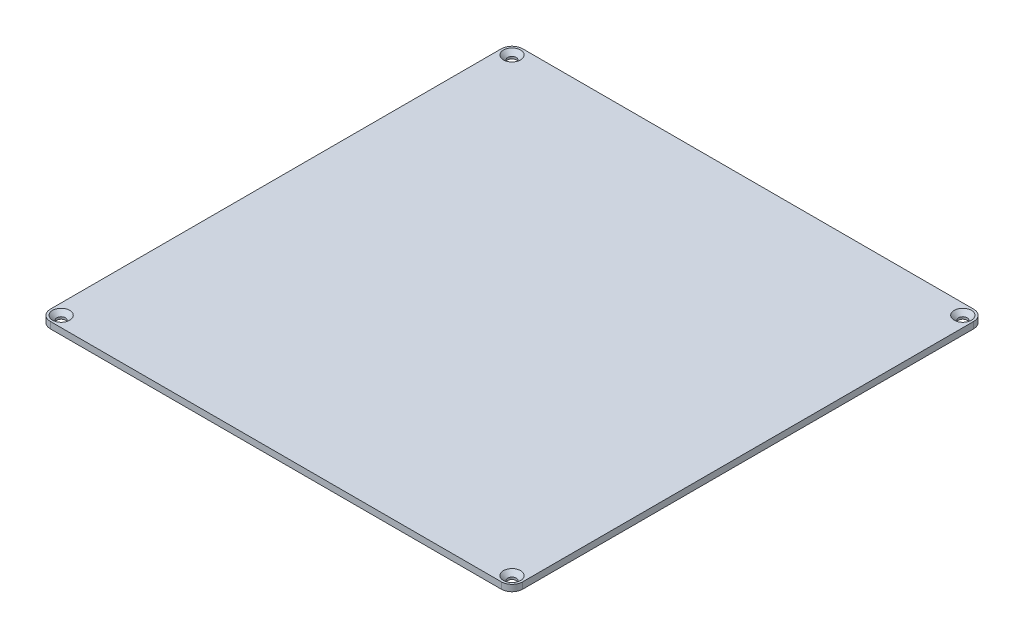
ISO-10303-21;
HEADER;
FILE_DESCRIPTION(('STEP AP214'),'2;1');
FILE_NAME('part.step','',(''),(''),'','','');
FILE_SCHEMA(('AUTOMOTIVE_DESIGN { 1 0 10303 214 1 1 1 1 }'));
ENDSEC;
DATA;
#1=APPLICATION_CONTEXT('core data for automotive mechanical design processes');
#2=APPLICATION_PROTOCOL_DEFINITION('international standard','automotive_design',2000,#1);
#3=PRODUCT_CONTEXT('',#1,'mechanical');
#4=PRODUCT('Part','Part','',(#3));
#5=PRODUCT_RELATED_PRODUCT_CATEGORY('part','',(#4));
#6=PRODUCT_DEFINITION_FORMATION('','',#4);
#7=PRODUCT_DEFINITION_CONTEXT('part definition',#1,'design');
#8=PRODUCT_DEFINITION('design','',#6,#7);
#9=PRODUCT_DEFINITION_SHAPE('','',#8);
#10=(LENGTH_UNIT() NAMED_UNIT(*) SI_UNIT(.MILLI.,.METRE.));
#11=(NAMED_UNIT(*) PLANE_ANGLE_UNIT() SI_UNIT($,.RADIAN.));
#12=(NAMED_UNIT(*) SI_UNIT($,.STERADIAN.) SOLID_ANGLE_UNIT());
#13=UNCERTAINTY_MEASURE_WITH_UNIT(LENGTH_MEASURE(1.E-05),#10,'distance_accuracy_value','');
#14=(GEOMETRIC_REPRESENTATION_CONTEXT(3) GLOBAL_UNCERTAINTY_ASSIGNED_CONTEXT((#13)) GLOBAL_UNIT_ASSIGNED_CONTEXT((#10,
#11,#12)) REPRESENTATION_CONTEXT('',''));
#15=CARTESIAN_POINT('',(0.,0.,0.));
#16=DIRECTION('',(0.,0.,1.));
#17=DIRECTION('',(1.,0.,0.));
#18=AXIS2_PLACEMENT_3D('',#15,#16,#17);
#19=CARTESIAN_POINT('',(0.,3.,0.));
#20=DIRECTION('',(-1.,0.,0.));
#21=DIRECTION('',(0.,0.,1.));
#22=AXIS2_PLACEMENT_3D('',#19,#20,#21);
#23=PLANE('',#22);
#24=DIRECTION('',(0.,0.,-1.));
#25=VECTOR('',#24,1.);
#26=CARTESIAN_POINT('',(0.,0.,0.));
#27=LINE('',#26,#25);
#28=CARTESIAN_POINT('',(0.,0.,-5.));
#29=VERTEX_POINT('',#28);
#30=CARTESIAN_POINT('',(0.,0.,-215.));
#31=VERTEX_POINT('',#30);
#32=EDGE_CURVE('E130',#29,#31,#27,.T.);
#33=ORIENTED_EDGE('',*,*,#32,.T.);
#34=DIRECTION('',(0.,-1.,0.));
#35=VECTOR('',#34,1.);
#36=CARTESIAN_POINT('',(0.,3.,-215.));
#37=LINE('',#36,#35);
#38=CARTESIAN_POINT('',(0.,3.,-215.));
#39=VERTEX_POINT('',#38);
#40=EDGE_CURVE('E108',#31,#39,#37,.F.);
#41=ORIENTED_EDGE('',*,*,#40,.T.);
#42=DIRECTION('',(0.,0.,-1.));
#43=VECTOR('',#42,1.);
#44=CARTESIAN_POINT('',(0.,3.,0.));
#45=LINE('',#44,#43);
#46=CARTESIAN_POINT('',(0.,3.,-5.));
#47=VERTEX_POINT('',#46);
#48=EDGE_CURVE('E140',#47,#39,#45,.T.);
#49=ORIENTED_EDGE('',*,*,#48,.F.);
#50=DIRECTION('',(0.,-1.,0.));
#51=VECTOR('',#50,1.);
#52=CARTESIAN_POINT('',(0.,3.,-5.));
#53=LINE('',#52,#51);
#54=EDGE_CURVE('E113',#47,#29,#53,.T.);
#55=ORIENTED_EDGE('',*,*,#54,.T.);
#56=EDGE_LOOP('',(#33,#41,#49,#55));
#57=FACE_BOUND('',#56,.T.);
#58=ADVANCED_FACE('F35',(#57),#23,.F.);
#59=CARTESIAN_POINT('',(0.,3.,-220.));
#60=DIRECTION('',(0.,0.,1.));
#61=DIRECTION('',(1.,0.,0.));
#62=AXIS2_PLACEMENT_3D('',#59,#60,#61);
#63=PLANE('',#62);
#64=DIRECTION('',(-1.,0.,0.));
#65=VECTOR('',#64,1.);
#66=CARTESIAN_POINT('',(0.,3.,-220.));
#67=LINE('',#66,#65);
#68=CARTESIAN_POINT('',(-5.,3.,-220.));
#69=VERTEX_POINT('',#68);
#70=CARTESIAN_POINT('',(-215.,3.,-220.));
#71=VERTEX_POINT('',#70);
#72=EDGE_CURVE('E123',#69,#71,#67,.T.);
#73=ORIENTED_EDGE('',*,*,#72,.F.);
#74=DIRECTION('',(0.,-1.,0.));
#75=VECTOR('',#74,1.);
#76=CARTESIAN_POINT('',(-5.,3.,-220.));
#77=LINE('',#76,#75);
#78=CARTESIAN_POINT('',(-5.,0.,-220.));
#79=VERTEX_POINT('',#78);
#80=EDGE_CURVE('E107',#69,#79,#77,.T.);
#81=ORIENTED_EDGE('',*,*,#80,.T.);
#82=DIRECTION('',(-1.,0.,0.));
#83=VECTOR('',#82,1.);
#84=CARTESIAN_POINT('',(0.,0.,-220.));
#85=LINE('',#84,#83);
#86=CARTESIAN_POINT('',(-215.,0.,-220.));
#87=VERTEX_POINT('',#86);
#88=EDGE_CURVE('E120',#79,#87,#85,.T.);
#89=ORIENTED_EDGE('',*,*,#88,.T.);
#90=DIRECTION('',(0.,-1.,0.));
#91=VECTOR('',#90,1.);
#92=CARTESIAN_POINT('',(-215.,3.,-220.));
#93=LINE('',#92,#91);
#94=EDGE_CURVE('E125',#87,#71,#93,.F.);
#95=ORIENTED_EDGE('',*,*,#94,.T.);
#96=EDGE_LOOP('',(#73,#81,#89,#95));
#97=FACE_BOUND('',#96,.T.);
#98=ADVANCED_FACE('F119',(#97),#63,.F.);
#99=CARTESIAN_POINT('',(-220.,3.,0.));
#100=DIRECTION('',(1.,0.,0.));
#101=DIRECTION('',(0.,0.,-1.));
#102=AXIS2_PLACEMENT_3D('',#99,#100,#101);
#103=PLANE('',#102);
#104=DIRECTION('',(0.,0.,1.));
#105=VECTOR('',#104,1.);
#106=CARTESIAN_POINT('',(-220.,0.,0.));
#107=LINE('',#106,#105);
#108=CARTESIAN_POINT('',(-220.,0.,-215.));
#109=VERTEX_POINT('',#108);
#110=CARTESIAN_POINT('',(-220.,0.,-5.));
#111=VERTEX_POINT('',#110);
#112=EDGE_CURVE('E129',#109,#111,#107,.T.);
#113=ORIENTED_EDGE('',*,*,#112,.T.);
#114=DIRECTION('',(0.,-1.,0.));
#115=VECTOR('',#114,1.);
#116=CARTESIAN_POINT('',(-220.,3.,-5.));
#117=LINE('',#116,#115);
#118=CARTESIAN_POINT('',(-220.,3.,-5.));
#119=VERTEX_POINT('',#118);
#120=EDGE_CURVE('E164',#111,#119,#117,.F.);
#121=ORIENTED_EDGE('',*,*,#120,.T.);
#122=DIRECTION('',(0.,0.,1.));
#123=VECTOR('',#122,1.);
#124=CARTESIAN_POINT('',(-220.,3.,0.));
#125=LINE('',#124,#123);
#126=CARTESIAN_POINT('',(-220.,3.,-215.));
#127=VERTEX_POINT('',#126);
#128=EDGE_CURVE('E270',#127,#119,#125,.T.);
#129=ORIENTED_EDGE('',*,*,#128,.F.);
#130=DIRECTION('',(0.,-1.,0.));
#131=VECTOR('',#130,1.);
#132=CARTESIAN_POINT('',(-220.,3.,-215.));
#133=LINE('',#132,#131);
#134=EDGE_CURVE('E161',#127,#109,#133,.T.);
#135=ORIENTED_EDGE('',*,*,#134,.T.);
#136=EDGE_LOOP('',(#113,#121,#129,#135));
#137=FACE_BOUND('',#136,.T.);
#138=ADVANCED_FACE('F209',(#137),#103,.F.);
#139=CARTESIAN_POINT('',(0.,3.,0.));
#140=DIRECTION('',(0.,0.,-1.));
#141=DIRECTION('',(-1.,0.,0.));
#142=AXIS2_PLACEMENT_3D('',#139,#140,#141);
#143=PLANE('',#142);
#144=DIRECTION('',(1.,0.,0.));
#145=VECTOR('',#144,1.);
#146=CARTESIAN_POINT('',(0.,0.,0.));
#147=LINE('',#146,#145);
#148=CARTESIAN_POINT('',(-215.,0.,0.));
#149=VERTEX_POINT('',#148);
#150=CARTESIAN_POINT('',(-5.,0.,0.));
#151=VERTEX_POINT('',#150);
#152=EDGE_CURVE('E133',#149,#151,#147,.T.);
#153=ORIENTED_EDGE('',*,*,#152,.T.);
#154=DIRECTION('',(0.,-1.,0.));
#155=VECTOR('',#154,1.);
#156=CARTESIAN_POINT('',(-5.,3.,0.));
#157=LINE('',#156,#155);
#158=CARTESIAN_POINT('',(-5.,3.,0.));
#159=VERTEX_POINT('',#158);
#160=EDGE_CURVE('E51',#151,#159,#157,.F.);
#161=ORIENTED_EDGE('',*,*,#160,.T.);
#162=DIRECTION('',(1.,0.,0.));
#163=VECTOR('',#162,1.);
#164=CARTESIAN_POINT('',(0.,3.,0.));
#165=LINE('',#164,#163);
#166=CARTESIAN_POINT('',(-215.,3.,0.));
#167=VERTEX_POINT('',#166);
#168=EDGE_CURVE('E141',#167,#159,#165,.T.);
#169=ORIENTED_EDGE('',*,*,#168,.F.);
#170=DIRECTION('',(0.,-1.,0.));
#171=VECTOR('',#170,1.);
#172=CARTESIAN_POINT('',(-215.,3.,0.));
#173=LINE('',#172,#171);
#174=EDGE_CURVE('E157',#167,#149,#173,.T.);
#175=ORIENTED_EDGE('',*,*,#174,.T.);
#176=EDGE_LOOP('',(#153,#161,#169,#175));
#177=FACE_BOUND('',#176,.T.);
#178=ADVANCED_FACE('F277',(#177),#143,.F.);
#179=CARTESIAN_POINT('',(0.,3.,0.));
#180=DIRECTION('',(0.,1.,0.));
#181=DIRECTION('',(0.,0.,1.));
#182=AXIS2_PLACEMENT_3D('',#179,#180,#181);
#183=PLANE('',#182);
#184=CARTESIAN_POINT('',(-215.,3.,-5.));
#185=DIRECTION('',(0.,1.,0.));
#186=DIRECTION('',(0.,0.,1.));
#187=AXIS2_PLACEMENT_3D('',#184,#185,#186);
#188=CIRCLE('',#187,4.00000000000003);
#189=CARTESIAN_POINT('',(-215.,3.,-0.999999999999968));
#190=VERTEX_POINT('',#189);
#191=EDGE_CURVE('E178',#190,#190,#188,.F.);
#192=ORIENTED_EDGE('',*,*,#191,.T.);
#193=EDGE_LOOP('',(#192));
#194=FACE_BOUND('',#193,.T.);
#195=CARTESIAN_POINT('',(-4.99999999999995,3.,-5.00000000000003));
#196=DIRECTION('',(0.,1.,0.));
#197=DIRECTION('',(0.,0.,1.));
#198=AXIS2_PLACEMENT_3D('',#195,#196,#197);
#199=CIRCLE('',#198,4.00000000000003);
#200=CARTESIAN_POINT('',(-4.99999999999995,3.,-0.999999999999994));
#201=VERTEX_POINT('',#200);
#202=EDGE_CURVE('E175',#201,#201,#199,.F.);
#203=ORIENTED_EDGE('',*,*,#202,.T.);
#204=EDGE_LOOP('',(#203));
#205=FACE_BOUND('',#204,.T.);
#206=CARTESIAN_POINT('',(-5.00000000000006,3.,-215.));
#207=DIRECTION('',(0.,1.,0.));
#208=DIRECTION('',(0.,0.,1.));
#209=AXIS2_PLACEMENT_3D('',#206,#207,#208);
#210=CIRCLE('',#209,4.00000000000003);
#211=CARTESIAN_POINT('',(-5.00000000000006,3.,-211.));
#212=VERTEX_POINT('',#211);
#213=EDGE_CURVE('E172',#212,#212,#210,.F.);
#214=ORIENTED_EDGE('',*,*,#213,.T.);
#215=EDGE_LOOP('',(#214));
#216=FACE_BOUND('',#215,.T.);
#217=CARTESIAN_POINT('',(-215.,3.,-215.));
#218=DIRECTION('',(0.,1.,0.));
#219=DIRECTION('',(0.,0.,1.));
#220=AXIS2_PLACEMENT_3D('',#217,#218,#219);
#221=CIRCLE('',#220,4.00000000000003);
#222=CARTESIAN_POINT('',(-215.,3.,-211.));
#223=VERTEX_POINT('',#222);
#224=EDGE_CURVE('E169',#223,#223,#221,.F.);
#225=ORIENTED_EDGE('',*,*,#224,.T.);
#226=EDGE_LOOP('',(#225));
#227=FACE_BOUND('',#226,.T.);
#228=ORIENTED_EDGE('',*,*,#48,.T.);
#229=CARTESIAN_POINT('',(-5.,3.,-215.));
#230=DIRECTION('',(0.,1.,0.));
#231=DIRECTION('',(0.,0.,1.));
#232=AXIS2_PLACEMENT_3D('',#229,#230,#231);
#233=CIRCLE('',#232,5.);
#234=EDGE_CURVE('E155',#39,#69,#233,.T.);
#235=ORIENTED_EDGE('',*,*,#234,.T.);
#236=ORIENTED_EDGE('',*,*,#72,.T.);
#237=CARTESIAN_POINT('',(-215.,3.,-215.));
#238=DIRECTION('',(0.,1.,0.));
#239=DIRECTION('',(0.,0.,1.));
#240=AXIS2_PLACEMENT_3D('',#237,#238,#239);
#241=CIRCLE('',#240,5.);
#242=EDGE_CURVE('E150',#71,#127,#241,.T.);
#243=ORIENTED_EDGE('',*,*,#242,.T.);
#244=ORIENTED_EDGE('',*,*,#128,.T.);
#245=CARTESIAN_POINT('',(-215.,3.,-5.));
#246=DIRECTION('',(0.,1.,0.));
#247=DIRECTION('',(0.,0.,1.));
#248=AXIS2_PLACEMENT_3D('',#245,#246,#247);
#249=CIRCLE('',#248,5.);
#250=EDGE_CURVE('E58',#119,#167,#249,.T.);
#251=ORIENTED_EDGE('',*,*,#250,.T.);
#252=ORIENTED_EDGE('',*,*,#168,.T.);
#253=CARTESIAN_POINT('',(-5.,3.,-5.));
#254=DIRECTION('',(0.,1.,0.));
#255=DIRECTION('',(0.,0.,1.));
#256=AXIS2_PLACEMENT_3D('',#253,#254,#255);
#257=CIRCLE('',#256,5.);
#258=EDGE_CURVE('E153',#159,#47,#257,.T.);
#259=ORIENTED_EDGE('',*,*,#258,.T.);
#260=EDGE_LOOP('',(#228,#235,#236,#243,#244,#251,#252,#259));
#261=FACE_BOUND('',#260,.T.);
#262=ADVANCED_FACE('F272',(#194,#205,#216,#227,#261),#183,.T.);
#263=CARTESIAN_POINT('',(0.,0.,0.));
#264=DIRECTION('',(0.,1.,0.));
#265=DIRECTION('',(0.,0.,1.));
#266=AXIS2_PLACEMENT_3D('',#263,#264,#265);
#267=PLANE('',#266);
#268=CARTESIAN_POINT('',(-5.00000000000006,0.,-215.));
#269=DIRECTION('',(0.,1.,0.));
#270=DIRECTION('',(0.,0.,-1.));
#271=AXIS2_PLACEMENT_3D('',#268,#269,#270);
#272=CIRCLE('',#271,2.);
#273=CARTESIAN_POINT('',(-5.00000000000006,0.,-217.));
#274=VERTEX_POINT('',#273);
#275=EDGE_CURVE('E262',#274,#274,#272,.T.);
#276=ORIENTED_EDGE('',*,*,#275,.T.);
#277=EDGE_LOOP('',(#276));
#278=FACE_BOUND('',#277,.T.);
#279=CARTESIAN_POINT('',(-4.99999999999995,0.,-5.00000000000003));
#280=DIRECTION('',(0.,1.,0.));
#281=DIRECTION('',(0.,0.,-1.));
#282=AXIS2_PLACEMENT_3D('',#279,#280,#281);
#283=CIRCLE('',#282,2.);
#284=CARTESIAN_POINT('',(-4.99999999999995,0.,-7.00000000000002));
#285=VERTEX_POINT('',#284);
#286=EDGE_CURVE('E257',#285,#285,#283,.T.);
#287=ORIENTED_EDGE('',*,*,#286,.T.);
#288=EDGE_LOOP('',(#287));
#289=FACE_BOUND('',#288,.T.);
#290=CARTESIAN_POINT('',(-215.,0.,-5.));
#291=DIRECTION('',(0.,1.,0.));
#292=DIRECTION('',(0.,0.,1.));
#293=AXIS2_PLACEMENT_3D('',#290,#291,#292);
#294=CIRCLE('',#293,2.);
#295=CARTESIAN_POINT('',(-215.,0.,-3.));
#296=VERTEX_POINT('',#295);
#297=EDGE_CURVE('E255',#296,#296,#294,.T.);
#298=ORIENTED_EDGE('',*,*,#297,.T.);
#299=EDGE_LOOP('',(#298));
#300=FACE_BOUND('',#299,.T.);
#301=CARTESIAN_POINT('',(-215.,0.,-215.));
#302=DIRECTION('',(0.,1.,0.));
#303=DIRECTION('',(0.,0.,1.));
#304=AXIS2_PLACEMENT_3D('',#301,#302,#303);
#305=CIRCLE('',#304,2.);
#306=CARTESIAN_POINT('',(-215.,0.,-213.));
#307=VERTEX_POINT('',#306);
#308=EDGE_CURVE('E135',#307,#307,#305,.T.);
#309=ORIENTED_EDGE('',*,*,#308,.T.);
#310=EDGE_LOOP('',(#309));
#311=FACE_BOUND('',#310,.T.);
#312=ORIENTED_EDGE('',*,*,#88,.F.);
#313=CARTESIAN_POINT('',(-5.,0.,-215.));
#314=DIRECTION('',(0.,1.,0.));
#315=DIRECTION('',(0.,0.,1.));
#316=AXIS2_PLACEMENT_3D('',#313,#314,#315);
#317=CIRCLE('',#316,5.);
#318=EDGE_CURVE('E103',#79,#31,#317,.F.);
#319=ORIENTED_EDGE('',*,*,#318,.T.);
#320=ORIENTED_EDGE('',*,*,#32,.F.);
#321=CARTESIAN_POINT('',(-5.,0.,-5.));
#322=DIRECTION('',(0.,1.,0.));
#323=DIRECTION('',(0.,0.,1.));
#324=AXIS2_PLACEMENT_3D('',#321,#322,#323);
#325=CIRCLE('',#324,5.);
#326=EDGE_CURVE('E114',#29,#151,#325,.F.);
#327=ORIENTED_EDGE('',*,*,#326,.T.);
#328=ORIENTED_EDGE('',*,*,#152,.F.);
#329=CARTESIAN_POINT('',(-215.,0.,-5.));
#330=DIRECTION('',(0.,1.,0.));
#331=DIRECTION('',(0.,0.,1.));
#332=AXIS2_PLACEMENT_3D('',#329,#330,#331);
#333=CIRCLE('',#332,5.);
#334=EDGE_CURVE('E144',#149,#111,#333,.F.);
#335=ORIENTED_EDGE('',*,*,#334,.T.);
#336=ORIENTED_EDGE('',*,*,#112,.F.);
#337=CARTESIAN_POINT('',(-215.,0.,-215.));
#338=DIRECTION('',(0.,1.,0.));
#339=DIRECTION('',(0.,0.,1.));
#340=AXIS2_PLACEMENT_3D('',#337,#338,#339);
#341=CIRCLE('',#340,5.);
#342=EDGE_CURVE('E124',#109,#87,#341,.F.);
#343=ORIENTED_EDGE('',*,*,#342,.T.);
#344=EDGE_LOOP('',(#312,#319,#320,#327,#328,#335,#336,#343));
#345=FACE_BOUND('',#344,.T.);
#346=ADVANCED_FACE('F127',(#278,#289,#300,#311,#345),#267,.F.);
#347=CARTESIAN_POINT('',(-5.,3.,-215.));
#348=DIRECTION('',(0.,-1.,0.));
#349=DIRECTION('',(0.,0.,-1.));
#350=AXIS2_PLACEMENT_3D('',#347,#348,#349);
#351=CYLINDRICAL_SURFACE('',#350,5.);
#352=ORIENTED_EDGE('',*,*,#234,.F.);
#353=ORIENTED_EDGE('',*,*,#40,.F.);
#354=ORIENTED_EDGE('',*,*,#318,.F.);
#355=ORIENTED_EDGE('',*,*,#80,.F.);
#356=EDGE_LOOP('',(#352,#353,#354,#355));
#357=FACE_BOUND('',#356,.T.);
#358=ADVANCED_FACE('F106',(#357),#351,.T.);
#359=CARTESIAN_POINT('',(-5.,3.,-5.));
#360=DIRECTION('',(0.,-1.,0.));
#361=DIRECTION('',(0.,0.,-1.));
#362=AXIS2_PLACEMENT_3D('',#359,#360,#361);
#363=CYLINDRICAL_SURFACE('',#362,5.);
#364=ORIENTED_EDGE('',*,*,#258,.F.);
#365=ORIENTED_EDGE('',*,*,#160,.F.);
#366=ORIENTED_EDGE('',*,*,#326,.F.);
#367=ORIENTED_EDGE('',*,*,#54,.F.);
#368=EDGE_LOOP('',(#364,#365,#366,#367));
#369=FACE_BOUND('',#368,.T.);
#370=ADVANCED_FACE('F215',(#369),#363,.T.);
#371=CARTESIAN_POINT('',(-215.,3.,-5.));
#372=DIRECTION('',(0.,-1.,0.));
#373=DIRECTION('',(0.,0.,-1.));
#374=AXIS2_PLACEMENT_3D('',#371,#372,#373);
#375=CYLINDRICAL_SURFACE('',#374,5.);
#376=ORIENTED_EDGE('',*,*,#250,.F.);
#377=ORIENTED_EDGE('',*,*,#120,.F.);
#378=ORIENTED_EDGE('',*,*,#334,.F.);
#379=ORIENTED_EDGE('',*,*,#174,.F.);
#380=EDGE_LOOP('',(#376,#377,#378,#379));
#381=FACE_BOUND('',#380,.T.);
#382=ADVANCED_FACE('F218',(#381),#375,.T.);
#383=CARTESIAN_POINT('',(-215.,3.,-215.));
#384=DIRECTION('',(0.,-1.,0.));
#385=DIRECTION('',(0.,0.,-1.));
#386=AXIS2_PLACEMENT_3D('',#383,#384,#385);
#387=CYLINDRICAL_SURFACE('',#386,5.);
#388=ORIENTED_EDGE('',*,*,#242,.F.);
#389=ORIENTED_EDGE('',*,*,#94,.F.);
#390=ORIENTED_EDGE('',*,*,#342,.F.);
#391=ORIENTED_EDGE('',*,*,#134,.F.);
#392=EDGE_LOOP('',(#388,#389,#390,#391));
#393=FACE_BOUND('',#392,.T.);
#394=ADVANCED_FACE('F222',(#393),#387,.T.);
#395=CARTESIAN_POINT('',(-215.,0.,-215.));
#396=DIRECTION('',(0.,1.,0.));
#397=DIRECTION('',(0.,0.,1.));
#398=AXIS2_PLACEMENT_3D('',#395,#396,#397);
#399=CYLINDRICAL_SURFACE('',#398,2.);
#400=CARTESIAN_POINT('',(-215.,0.999999999999986,-215.));
#401=DIRECTION('',(0.,1.,0.));
#402=DIRECTION('',(0.,0.,1.));
#403=AXIS2_PLACEMENT_3D('',#400,#401,#402);
#404=CIRCLE('',#403,2.);
#405=CARTESIAN_POINT('',(-215.,0.999999999999986,-213.));
#406=VERTEX_POINT('',#405);
#407=EDGE_CURVE('E11',#406,#406,#404,.T.);
#408=ORIENTED_EDGE('',*,*,#407,.T.);
#409=EDGE_LOOP('',(#408));
#410=FACE_BOUND('',#409,.T.);
#411=ORIENTED_EDGE('',*,*,#308,.F.);
#412=EDGE_LOOP('',(#411));
#413=FACE_BOUND('',#412,.T.);
#414=ADVANCED_FACE('F226',(#410,#413),#399,.F.);
#415=CARTESIAN_POINT('',(-215.,0.,-5.));
#416=DIRECTION('',(0.,1.,0.));
#417=DIRECTION('',(0.,0.,1.));
#418=AXIS2_PLACEMENT_3D('',#415,#416,#417);
#419=CYLINDRICAL_SURFACE('',#418,2.);
#420=CARTESIAN_POINT('',(-215.,0.999999999999986,-5.));
#421=DIRECTION('',(0.,1.,0.));
#422=DIRECTION('',(0.,0.,1.));
#423=AXIS2_PLACEMENT_3D('',#420,#421,#422);
#424=CIRCLE('',#423,2.);
#425=CARTESIAN_POINT('',(-215.,0.999999999999986,-3.));
#426=VERTEX_POINT('',#425);
#427=EDGE_CURVE('E166',#426,#426,#424,.T.);
#428=ORIENTED_EDGE('',*,*,#427,.T.);
#429=EDGE_LOOP('',(#428));
#430=FACE_BOUND('',#429,.T.);
#431=ORIENTED_EDGE('',*,*,#297,.F.);
#432=EDGE_LOOP('',(#431));
#433=FACE_BOUND('',#432,.T.);
#434=ADVANCED_FACE('F249',(#430,#433),#419,.F.);
#435=CARTESIAN_POINT('',(-4.99999999999995,0.,-5.00000000000003));
#436=DIRECTION('',(0.,1.,0.));
#437=DIRECTION('',(0.,0.,1.));
#438=AXIS2_PLACEMENT_3D('',#435,#436,#437);
#439=CYLINDRICAL_SURFACE('',#438,2.);
#440=CARTESIAN_POINT('',(-4.99999999999995,0.999999999999986,-5.00000000000003));
#441=DIRECTION('',(0.,1.,0.));
#442=DIRECTION('',(0.,0.,1.));
#443=AXIS2_PLACEMENT_3D('',#440,#441,#442);
#444=CIRCLE('',#443,2.);
#445=CARTESIAN_POINT('',(-4.99999999999995,0.999999999999986,-3.00000000000003));
#446=VERTEX_POINT('',#445);
#447=EDGE_CURVE('E181',#446,#446,#444,.T.);
#448=ORIENTED_EDGE('',*,*,#447,.T.);
#449=EDGE_LOOP('',(#448));
#450=FACE_BOUND('',#449,.T.);
#451=ORIENTED_EDGE('',*,*,#286,.F.);
#452=EDGE_LOOP('',(#451));
#453=FACE_BOUND('',#452,.T.);
#454=ADVANCED_FACE('F243',(#450,#453),#439,.F.);
#455=CARTESIAN_POINT('',(-5.00000000000006,0.,-215.));
#456=DIRECTION('',(0.,1.,0.));
#457=DIRECTION('',(0.,0.,1.));
#458=AXIS2_PLACEMENT_3D('',#455,#456,#457);
#459=CYLINDRICAL_SURFACE('',#458,2.);
#460=CARTESIAN_POINT('',(-5.00000000000006,0.999999999999987,-215.));
#461=DIRECTION('',(0.,1.,0.));
#462=DIRECTION('',(0.,0.,1.));
#463=AXIS2_PLACEMENT_3D('',#460,#461,#462);
#464=CIRCLE('',#463,2.);
#465=CARTESIAN_POINT('',(-5.00000000000006,0.999999999999987,-213.));
#466=VERTEX_POINT('',#465);
#467=EDGE_CURVE('E44',#466,#466,#464,.T.);
#468=ORIENTED_EDGE('',*,*,#467,.T.);
#469=EDGE_LOOP('',(#468));
#470=FACE_BOUND('',#469,.T.);
#471=ORIENTED_EDGE('',*,*,#275,.F.);
#472=EDGE_LOOP('',(#471));
#473=FACE_BOUND('',#472,.T.);
#474=ADVANCED_FACE('F186',(#470,#473),#459,.F.);
#475=CARTESIAN_POINT('',(-215.,0.999999999999986,-5.));
#476=DIRECTION('',(0.,1.,0.));
#477=DIRECTION('',(0.,0.,1.));
#478=AXIS2_PLACEMENT_3D('',#475,#476,#477);
#479=CONICAL_SURFACE('',#478,2.,0.785398163397454);
#480=ORIENTED_EDGE('',*,*,#191,.F.);
#481=EDGE_LOOP('',(#480));
#482=FACE_BOUND('',#481,.T.);
#483=ORIENTED_EDGE('',*,*,#427,.F.);
#484=EDGE_LOOP('',(#483));
#485=FACE_BOUND('',#484,.T.);
#486=ADVANCED_FACE('F198',(#482,#485),#479,.F.);
#487=CARTESIAN_POINT('',(-4.99999999999995,0.999999999999986,-5.00000000000003));
#488=DIRECTION('',(0.,1.,0.));
#489=DIRECTION('',(0.,0.,1.));
#490=AXIS2_PLACEMENT_3D('',#487,#488,#489);
#491=CONICAL_SURFACE('',#490,2.,0.785398163397454);
#492=ORIENTED_EDGE('',*,*,#202,.F.);
#493=EDGE_LOOP('',(#492));
#494=FACE_BOUND('',#493,.T.);
#495=ORIENTED_EDGE('',*,*,#447,.F.);
#496=EDGE_LOOP('',(#495));
#497=FACE_BOUND('',#496,.T.);
#498=ADVANCED_FACE('F191',(#494,#497),#491,.F.);
#499=CARTESIAN_POINT('',(-5.00000000000006,0.999999999999987,-215.));
#500=DIRECTION('',(0.,1.,0.));
#501=DIRECTION('',(0.,0.,1.));
#502=AXIS2_PLACEMENT_3D('',#499,#500,#501);
#503=CONICAL_SURFACE('',#502,2.,0.785398163397453);
#504=ORIENTED_EDGE('',*,*,#213,.F.);
#505=EDGE_LOOP('',(#504));
#506=FACE_BOUND('',#505,.T.);
#507=ORIENTED_EDGE('',*,*,#467,.F.);
#508=EDGE_LOOP('',(#507));
#509=FACE_BOUND('',#508,.T.);
#510=ADVANCED_FACE('F189',(#506,#509),#503,.F.);
#511=CARTESIAN_POINT('',(-215.,0.999999999999986,-215.));
#512=DIRECTION('',(0.,1.,0.));
#513=DIRECTION('',(0.,0.,1.));
#514=AXIS2_PLACEMENT_3D('',#511,#512,#513);
#515=CONICAL_SURFACE('',#514,2.,0.785398163397453);
#516=ORIENTED_EDGE('',*,*,#224,.F.);
#517=EDGE_LOOP('',(#516));
#518=FACE_BOUND('',#517,.T.);
#519=ORIENTED_EDGE('',*,*,#407,.F.);
#520=EDGE_LOOP('',(#519));
#521=FACE_BOUND('',#520,.T.);
#522=ADVANCED_FACE('F38',(#518,#521),#515,.F.);
#523=CLOSED_SHELL('',(#58,#98,#138,#178,#262,#346,#358,#370,#382,#394,#414,#434,#454,#474,#486,
#498,#510,#522));
#524=MANIFOLD_SOLID_BREP('B2',#523);
#525=ADVANCED_BREP_SHAPE_REPRESENTATION('',(#18,#524),#14);
#526=SHAPE_DEFINITION_REPRESENTATION(#9,#525);
ENDSEC;
END-ISO-10303-21;
